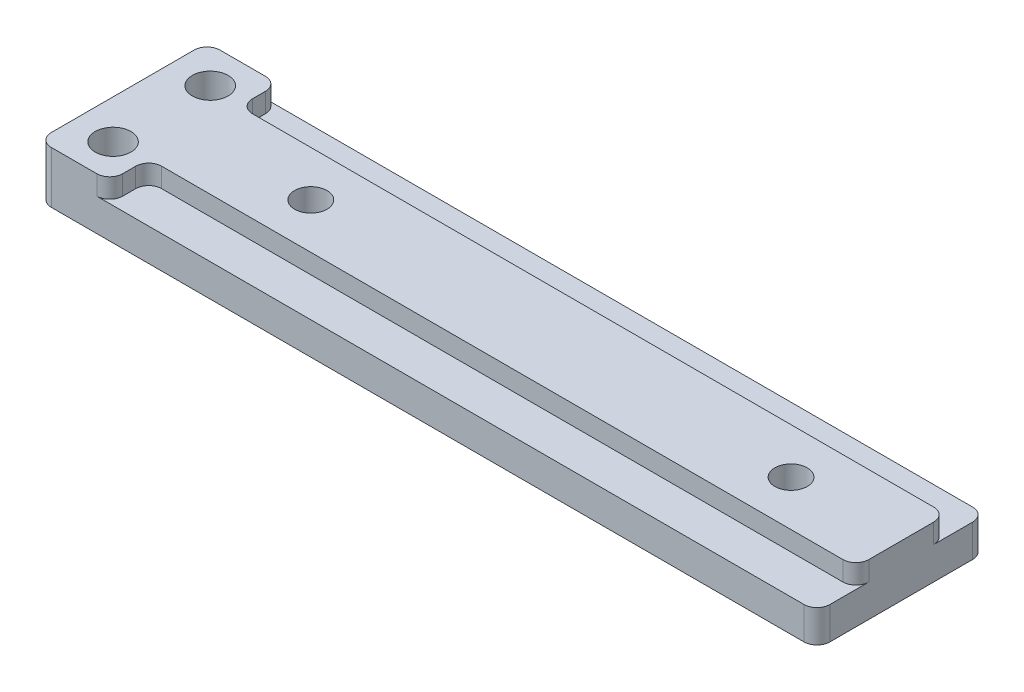
ISO-10303-21;
HEADER;
FILE_DESCRIPTION(('STEP AP214'),'2;1');
FILE_NAME('part.step','',(''),(''),'','','');
FILE_SCHEMA(('AUTOMOTIVE_DESIGN { 1 0 10303 214 1 1 1 1 }'));
ENDSEC;
DATA;
#1=APPLICATION_CONTEXT('core data for automotive mechanical design processes');
#2=APPLICATION_PROTOCOL_DEFINITION('international standard','automotive_design',2000,#1);
#3=PRODUCT_CONTEXT('',#1,'mechanical');
#4=PRODUCT('Part','Part','',(#3));
#5=PRODUCT_RELATED_PRODUCT_CATEGORY('part','',(#4));
#6=PRODUCT_DEFINITION_FORMATION('','',#4);
#7=PRODUCT_DEFINITION_CONTEXT('part definition',#1,'design');
#8=PRODUCT_DEFINITION('design','',#6,#7);
#9=PRODUCT_DEFINITION_SHAPE('','',#8);
#10=(LENGTH_UNIT() NAMED_UNIT(*) SI_UNIT(.MILLI.,.METRE.));
#11=(NAMED_UNIT(*) PLANE_ANGLE_UNIT() SI_UNIT($,.RADIAN.));
#12=(NAMED_UNIT(*) SI_UNIT($,.STERADIAN.) SOLID_ANGLE_UNIT());
#13=UNCERTAINTY_MEASURE_WITH_UNIT(LENGTH_MEASURE(1.E-05),#10,'distance_accuracy_value','');
#14=(GEOMETRIC_REPRESENTATION_CONTEXT(3) GLOBAL_UNCERTAINTY_ASSIGNED_CONTEXT((#13)) GLOBAL_UNIT_ASSIGNED_CONTEXT((#10,
#11,#12)) REPRESENTATION_CONTEXT('',''));
#15=CARTESIAN_POINT('',(0.,0.,0.));
#16=DIRECTION('',(0.,0.,1.));
#17=DIRECTION('',(1.,0.,0.));
#18=AXIS2_PLACEMENT_3D('',#15,#16,#17);
#19=CARTESIAN_POINT('',(0.,10.16,0.));
#20=DIRECTION('',(0.,-1.,0.));
#21=DIRECTION('',(0.,0.,-1.));
#22=AXIS2_PLACEMENT_3D('',#19,#20,#21);
#23=PLANE('',#22);
#24=DIRECTION('',(0.,0.,-1.));
#25=VECTOR('',#24,1.);
#26=CARTESIAN_POINT('',(152.4,10.16,-33.02));
#27=LINE('',#26,#25);
#28=CARTESIAN_POINT('',(152.4,10.16,-10.16));
#29=VERTEX_POINT('',#28);
#30=CARTESIAN_POINT('',(152.4,10.16,-22.86));
#31=VERTEX_POINT('',#30);
#32=EDGE_CURVE('E344',#29,#31,#27,.T.);
#33=ORIENTED_EDGE('',*,*,#32,.T.);
#34=CARTESIAN_POINT('',(149.86,10.16,-22.86));
#35=DIRECTION('',(0.,-1.,0.));
#36=DIRECTION('',(0.,0.,-1.));
#37=AXIS2_PLACEMENT_3D('',#34,#35,#36);
#38=CIRCLE('',#37,2.54);
#39=CARTESIAN_POINT('',(149.86,10.16,-25.4));
#40=VERTEX_POINT('',#39);
#41=EDGE_CURVE('E243',#31,#40,#38,.F.);
#42=ORIENTED_EDGE('',*,*,#41,.T.);
#43=DIRECTION('',(1.,0.,0.));
#44=VECTOR('',#43,1.);
#45=CARTESIAN_POINT('',(13.97,10.16,-25.3999999999999));
#46=LINE('',#45,#44);
#47=CARTESIAN_POINT('',(16.51,10.16,-25.3999999999999));
#48=VERTEX_POINT('',#47);
#49=EDGE_CURVE('E291',#48,#40,#46,.T.);
#50=ORIENTED_EDGE('',*,*,#49,.F.);
#51=CARTESIAN_POINT('',(16.51,10.16,-27.9399999999999));
#52=DIRECTION('',(0.,-1.,0.));
#53=DIRECTION('',(0.,0.,-1.));
#54=AXIS2_PLACEMENT_3D('',#51,#52,#53);
#55=CIRCLE('',#54,2.54);
#56=CARTESIAN_POINT('',(13.97,10.16,-27.9399999999999));
#57=VERTEX_POINT('',#56);
#58=EDGE_CURVE('E47',#48,#57,#55,.T.);
#59=ORIENTED_EDGE('',*,*,#58,.T.);
#60=DIRECTION('',(0.,0.,1.));
#61=VECTOR('',#60,1.);
#62=CARTESIAN_POINT('',(13.97,10.16,-33.0199999999999));
#63=LINE('',#62,#61);
#64=CARTESIAN_POINT('',(13.97,10.16,-30.48));
#65=VERTEX_POINT('',#64);
#66=EDGE_CURVE('E289',#65,#57,#63,.T.);
#67=ORIENTED_EDGE('',*,*,#66,.F.);
#68=CARTESIAN_POINT('',(11.43,10.16,-30.48));
#69=DIRECTION('',(0.,-1.,0.));
#70=DIRECTION('',(0.,0.,-1.));
#71=AXIS2_PLACEMENT_3D('',#68,#69,#70);
#72=CIRCLE('',#71,2.54);
#73=CARTESIAN_POINT('',(11.43,10.16,-33.02));
#74=VERTEX_POINT('',#73);
#75=EDGE_CURVE('E237',#65,#74,#72,.F.);
#76=ORIENTED_EDGE('',*,*,#75,.T.);
#77=DIRECTION('',(-1.,0.,0.));
#78=VECTOR('',#77,1.);
#79=CARTESIAN_POINT('',(0.,10.16,-33.02));
#80=LINE('',#79,#78);
#81=CARTESIAN_POINT('',(2.54,10.16,-33.02));
#82=VERTEX_POINT('',#81);
#83=EDGE_CURVE('E347',#74,#82,#80,.T.);
#84=ORIENTED_EDGE('',*,*,#83,.T.);
#85=CARTESIAN_POINT('',(2.54,10.16,-30.48));
#86=DIRECTION('',(0.,-1.,0.));
#87=DIRECTION('',(0.,0.,-1.));
#88=AXIS2_PLACEMENT_3D('',#85,#86,#87);
#89=CIRCLE('',#88,2.54);
#90=CARTESIAN_POINT('',(0.,10.16,-30.48));
#91=VERTEX_POINT('',#90);
#92=EDGE_CURVE('E235',#82,#91,#89,.F.);
#93=ORIENTED_EDGE('',*,*,#92,.T.);
#94=DIRECTION('',(0.,0.,1.));
#95=VECTOR('',#94,1.);
#96=CARTESIAN_POINT('',(0.,10.16,0.));
#97=LINE('',#96,#95);
#98=CARTESIAN_POINT('',(0.,10.16,-2.54));
#99=VERTEX_POINT('',#98);
#100=EDGE_CURVE('E350',#91,#99,#97,.T.);
#101=ORIENTED_EDGE('',*,*,#100,.T.);
#102=CARTESIAN_POINT('',(2.53999999999999,10.16,-2.54));
#103=DIRECTION('',(0.,-1.,0.));
#104=DIRECTION('',(0.,0.,-1.));
#105=AXIS2_PLACEMENT_3D('',#102,#103,#104);
#106=CIRCLE('',#105,2.54);
#107=CARTESIAN_POINT('',(2.53999999999999,10.16,0.));
#108=VERTEX_POINT('',#107);
#109=EDGE_CURVE('E233',#99,#108,#106,.F.);
#110=ORIENTED_EDGE('',*,*,#109,.T.);
#111=DIRECTION('',(1.,0.,0.));
#112=VECTOR('',#111,1.);
#113=CARTESIAN_POINT('',(152.4,10.16,0.));
#114=LINE('',#113,#112);
#115=CARTESIAN_POINT('',(11.4300000000001,10.16,0.));
#116=VERTEX_POINT('',#115);
#117=EDGE_CURVE('E341',#108,#116,#114,.T.);
#118=ORIENTED_EDGE('',*,*,#117,.T.);
#119=CARTESIAN_POINT('',(11.43,10.16,-2.54));
#120=DIRECTION('',(0.,-1.,0.));
#121=DIRECTION('',(0.,0.,-1.));
#122=AXIS2_PLACEMENT_3D('',#119,#120,#121);
#123=CIRCLE('',#122,2.54);
#124=CARTESIAN_POINT('',(13.97,10.16,-2.54));
#125=VERTEX_POINT('',#124);
#126=EDGE_CURVE('E239',#116,#125,#123,.F.);
#127=ORIENTED_EDGE('',*,*,#126,.T.);
#128=DIRECTION('',(0.,0.,1.));
#129=VECTOR('',#128,1.);
#130=CARTESIAN_POINT('',(13.97,10.16,1.07944055687566E-13));
#131=LINE('',#130,#129);
#132=CARTESIAN_POINT('',(13.97,10.16,-5.07999999999989));
#133=VERTEX_POINT('',#132);
#134=EDGE_CURVE('E390',#133,#125,#131,.T.);
#135=ORIENTED_EDGE('',*,*,#134,.F.);
#136=CARTESIAN_POINT('',(16.51,10.16,-5.07999999999989));
#137=DIRECTION('',(0.,-1.,0.));
#138=DIRECTION('',(0.,0.,-1.));
#139=AXIS2_PLACEMENT_3D('',#136,#137,#138);
#140=CIRCLE('',#139,2.54);
#141=CARTESIAN_POINT('',(16.51,10.16,-7.61999999999989));
#142=VERTEX_POINT('',#141);
#143=EDGE_CURVE('E281',#133,#142,#140,.T.);
#144=ORIENTED_EDGE('',*,*,#143,.T.);
#145=DIRECTION('',(1.,0.,0.));
#146=VECTOR('',#145,1.);
#147=CARTESIAN_POINT('',(13.97,10.16,-7.61999999999989));
#148=LINE('',#147,#146);
#149=CARTESIAN_POINT('',(149.86,10.16,-7.62000000000001));
#150=VERTEX_POINT('',#149);
#151=EDGE_CURVE('E322',#142,#150,#148,.T.);
#152=ORIENTED_EDGE('',*,*,#151,.T.);
#153=CARTESIAN_POINT('',(149.86,10.16,-10.16));
#154=DIRECTION('',(0.,-1.,0.));
#155=DIRECTION('',(0.,0.,-1.));
#156=AXIS2_PLACEMENT_3D('',#153,#154,#155);
#157=CIRCLE('',#156,2.54);
#158=EDGE_CURVE('E241',#150,#29,#157,.F.);
#159=ORIENTED_EDGE('',*,*,#158,.T.);
#160=EDGE_LOOP('',(#33,#42,#50,#59,#67,#76,#84,#93,#101,#110,#118,#127,#135,#144,#152,#159));
#161=FACE_BOUND('',#160,.T.);
#162=CARTESIAN_POINT('',(7.62,10.16,-26.02));
#163=DIRECTION('',(0.,1.,0.));
#164=DIRECTION('',(0.,0.,1.));
#165=AXIS2_PLACEMENT_3D('',#162,#163,#164);
#166=CIRCLE('',#165,3.5);
#167=CARTESIAN_POINT('',(7.62,10.16,-22.52));
#168=VERTEX_POINT('',#167);
#169=EDGE_CURVE('E335',#168,#168,#166,.T.);
#170=ORIENTED_EDGE('',*,*,#169,.F.);
#171=EDGE_LOOP('',(#170));
#172=FACE_BOUND('',#171,.T.);
#173=CARTESIAN_POINT('',(7.61999999999999,10.16,-7.));
#174=DIRECTION('',(0.,1.,0.));
#175=DIRECTION('',(0.,0.,-1.));
#176=AXIS2_PLACEMENT_3D('',#173,#174,#175);
#177=CIRCLE('',#176,3.5);
#178=CARTESIAN_POINT('',(7.61999999999999,10.16,-10.5));
#179=VERTEX_POINT('',#178);
#180=EDGE_CURVE('E329',#179,#179,#177,.T.);
#181=ORIENTED_EDGE('',*,*,#180,.F.);
#182=EDGE_LOOP('',(#181));
#183=FACE_BOUND('',#182,.T.);
#184=CARTESIAN_POINT('',(130.8199949,10.16,-16.51));
#185=DIRECTION('',(0.,1.,0.));
#186=DIRECTION('',(0.,0.,1.));
#187=AXIS2_PLACEMENT_3D('',#184,#185,#186);
#188=CIRCLE('',#187,3.175);
#189=CARTESIAN_POINT('',(130.8199949,10.16,-13.335));
#190=VERTEX_POINT('',#189);
#191=EDGE_CURVE('E323',#190,#190,#188,.T.);
#192=ORIENTED_EDGE('',*,*,#191,.F.);
#193=EDGE_LOOP('',(#192));
#194=FACE_BOUND('',#193,.T.);
#195=CARTESIAN_POINT('',(36.8200051,10.16,-16.51));
#196=DIRECTION('',(0.,1.,0.));
#197=DIRECTION('',(0.,0.,1.));
#198=AXIS2_PLACEMENT_3D('',#195,#196,#197);
#199=CIRCLE('',#198,3.175);
#200=CARTESIAN_POINT('',(36.8200051,10.16,-13.335));
#201=VERTEX_POINT('',#200);
#202=EDGE_CURVE('E315',#201,#201,#199,.T.);
#203=ORIENTED_EDGE('',*,*,#202,.F.);
#204=EDGE_LOOP('',(#203));
#205=FACE_BOUND('',#204,.T.);
#206=ADVANCED_FACE('F39',(#161,#172,#183,#194,#205),#23,.F.);
#207=CARTESIAN_POINT('',(0.,0.,0.));
#208=DIRECTION('',(0.,-1.,0.));
#209=DIRECTION('',(0.,0.,-1.));
#210=AXIS2_PLACEMENT_3D('',#207,#208,#209);
#211=PLANE('',#210);
#212=CARTESIAN_POINT('',(130.8199949,0.,-16.51));
#213=DIRECTION('',(0.,1.,0.));
#214=DIRECTION('',(0.,0.,1.));
#215=AXIS2_PLACEMENT_3D('',#212,#213,#214);
#216=CIRCLE('',#215,3.175);
#217=CARTESIAN_POINT('',(130.8199949,0.,-13.335));
#218=VERTEX_POINT('',#217);
#219=EDGE_CURVE('E318',#218,#218,#216,.T.);
#220=ORIENTED_EDGE('',*,*,#219,.T.);
#221=EDGE_LOOP('',(#220));
#222=FACE_BOUND('',#221,.T.);
#223=CARTESIAN_POINT('',(7.62,0.,-26.02));
#224=DIRECTION('',(0.,1.,0.));
#225=DIRECTION('',(0.,0.,1.));
#226=AXIS2_PLACEMENT_3D('',#223,#224,#225);
#227=CIRCLE('',#226,3.5);
#228=CARTESIAN_POINT('',(7.62,0.,-22.52));
#229=VERTEX_POINT('',#228);
#230=EDGE_CURVE('E332',#229,#229,#227,.T.);
#231=ORIENTED_EDGE('',*,*,#230,.T.);
#232=EDGE_LOOP('',(#231));
#233=FACE_BOUND('',#232,.T.);
#234=DIRECTION('',(-1.,0.,0.));
#235=VECTOR('',#234,1.);
#236=CARTESIAN_POINT('',(0.,0.,-33.02));
#237=LINE('',#236,#235);
#238=CARTESIAN_POINT('',(149.86,0.,-33.02));
#239=VERTEX_POINT('',#238);
#240=CARTESIAN_POINT('',(2.54,0.,-33.02));
#241=VERTEX_POINT('',#240);
#242=EDGE_CURVE('E358',#239,#241,#237,.T.);
#243=ORIENTED_EDGE('',*,*,#242,.F.);
#244=CARTESIAN_POINT('',(149.86,0.,-30.48));
#245=DIRECTION('',(0.,-1.,0.));
#246=DIRECTION('',(0.,0.,-1.));
#247=AXIS2_PLACEMENT_3D('',#244,#245,#246);
#248=CIRCLE('',#247,2.54);
#249=CARTESIAN_POINT('',(152.4,0.,-30.48));
#250=VERTEX_POINT('',#249);
#251=EDGE_CURVE('E205',#239,#250,#248,.T.);
#252=ORIENTED_EDGE('',*,*,#251,.T.);
#253=DIRECTION('',(0.,0.,-1.));
#254=VECTOR('',#253,1.);
#255=CARTESIAN_POINT('',(152.4,0.,-33.02));
#256=LINE('',#255,#254);
#257=CARTESIAN_POINT('',(152.4,0.,-2.54000000000001));
#258=VERTEX_POINT('',#257);
#259=EDGE_CURVE('E355',#258,#250,#256,.T.);
#260=ORIENTED_EDGE('',*,*,#259,.F.);
#261=CARTESIAN_POINT('',(149.86,0.,-2.54000000000001));
#262=DIRECTION('',(0.,-1.,0.));
#263=DIRECTION('',(0.,0.,-1.));
#264=AXIS2_PLACEMENT_3D('',#261,#262,#263);
#265=CIRCLE('',#264,2.54);
#266=CARTESIAN_POINT('',(149.86,0.,0.));
#267=VERTEX_POINT('',#266);
#268=EDGE_CURVE('E215',#258,#267,#265,.T.);
#269=ORIENTED_EDGE('',*,*,#268,.T.);
#270=DIRECTION('',(1.,0.,0.));
#271=VECTOR('',#270,1.);
#272=CARTESIAN_POINT('',(152.4,0.,0.));
#273=LINE('',#272,#271);
#274=CARTESIAN_POINT('',(2.53999999999999,0.,0.));
#275=VERTEX_POINT('',#274);
#276=EDGE_CURVE('E338',#275,#267,#273,.T.);
#277=ORIENTED_EDGE('',*,*,#276,.F.);
#278=CARTESIAN_POINT('',(2.53999999999999,0.,-2.54));
#279=DIRECTION('',(0.,-1.,0.));
#280=DIRECTION('',(0.,0.,-1.));
#281=AXIS2_PLACEMENT_3D('',#278,#279,#280);
#282=CIRCLE('',#281,2.54);
#283=CARTESIAN_POINT('',(0.,0.,-2.54));
#284=VERTEX_POINT('',#283);
#285=EDGE_CURVE('E206',#275,#284,#282,.T.);
#286=ORIENTED_EDGE('',*,*,#285,.T.);
#287=DIRECTION('',(0.,0.,1.));
#288=VECTOR('',#287,1.);
#289=CARTESIAN_POINT('',(0.,0.,0.));
#290=LINE('',#289,#288);
#291=CARTESIAN_POINT('',(0.,0.,-30.48));
#292=VERTEX_POINT('',#291);
#293=EDGE_CURVE('E345',#292,#284,#290,.T.);
#294=ORIENTED_EDGE('',*,*,#293,.F.);
#295=CARTESIAN_POINT('',(2.54,0.,-30.48));
#296=DIRECTION('',(0.,-1.,0.));
#297=DIRECTION('',(0.,0.,-1.));
#298=AXIS2_PLACEMENT_3D('',#295,#296,#297);
#299=CIRCLE('',#298,2.54);
#300=EDGE_CURVE('E208',#292,#241,#299,.T.);
#301=ORIENTED_EDGE('',*,*,#300,.T.);
#302=EDGE_LOOP('',(#243,#252,#260,#269,#277,#286,#294,#301));
#303=FACE_BOUND('',#302,.T.);
#304=CARTESIAN_POINT('',(7.61999999999999,0.,-7.));
#305=DIRECTION('',(0.,1.,0.));
#306=DIRECTION('',(0.,0.,-1.));
#307=AXIS2_PLACEMENT_3D('',#304,#305,#306);
#308=CIRCLE('',#307,3.5);
#309=CARTESIAN_POINT('',(7.61999999999999,0.,-10.5));
#310=VERTEX_POINT('',#309);
#311=EDGE_CURVE('E326',#310,#310,#308,.T.);
#312=ORIENTED_EDGE('',*,*,#311,.T.);
#313=EDGE_LOOP('',(#312));
#314=FACE_BOUND('',#313,.T.);
#315=CARTESIAN_POINT('',(36.8200051,0.,-16.51));
#316=DIRECTION('',(0.,1.,0.));
#317=DIRECTION('',(0.,0.,1.));
#318=AXIS2_PLACEMENT_3D('',#315,#316,#317);
#319=CIRCLE('',#318,3.175);
#320=CARTESIAN_POINT('',(36.8200051,0.,-13.335));
#321=VERTEX_POINT('',#320);
#322=EDGE_CURVE('E319',#321,#321,#319,.T.);
#323=ORIENTED_EDGE('',*,*,#322,.T.);
#324=EDGE_LOOP('',(#323));
#325=FACE_BOUND('',#324,.T.);
#326=ADVANCED_FACE('F372',(#222,#233,#303,#314,#325),#211,.T.);
#327=CARTESIAN_POINT('',(152.4,10.16,0.));
#328=DIRECTION('',(0.,0.,-1.));
#329=DIRECTION('',(-1.,0.,0.));
#330=AXIS2_PLACEMENT_3D('',#327,#328,#329);
#331=PLANE('',#330);
#332=ORIENTED_EDGE('',*,*,#276,.T.);
#333=DIRECTION('',(0.,-1.,0.));
#334=VECTOR('',#333,1.);
#335=CARTESIAN_POINT('',(149.86,10.16,0.));
#336=LINE('',#335,#334);
#337=CARTESIAN_POINT('',(149.86,6.35,0.));
#338=VERTEX_POINT('',#337);
#339=EDGE_CURVE('E250',#267,#338,#336,.F.);
#340=ORIENTED_EDGE('',*,*,#339,.T.);
#341=DIRECTION('',(1.,0.,0.));
#342=VECTOR('',#341,1.);
#343=CARTESIAN_POINT('',(13.97,6.35,1.07944055687566E-13));
#344=LINE('',#343,#342);
#345=CARTESIAN_POINT('',(11.43,6.35,0.));
#346=VERTEX_POINT('',#345);
#347=EDGE_CURVE('E394',#346,#338,#344,.T.);
#348=ORIENTED_EDGE('',*,*,#347,.F.);
#349=DIRECTION('',(0.,-1.,0.));
#350=VECTOR('',#349,1.);
#351=CARTESIAN_POINT('',(11.4300000000001,10.16,0.));
#352=LINE('',#351,#350);
#353=EDGE_CURVE('E248',#346,#116,#352,.F.);
#354=ORIENTED_EDGE('',*,*,#353,.T.);
#355=ORIENTED_EDGE('',*,*,#117,.F.);
#356=DIRECTION('',(0.,-1.,0.));
#357=VECTOR('',#356,1.);
#358=CARTESIAN_POINT('',(2.53999999999999,10.16,0.));
#359=LINE('',#358,#357);
#360=EDGE_CURVE('E245',#108,#275,#359,.T.);
#361=ORIENTED_EDGE('',*,*,#360,.T.);
#362=EDGE_LOOP('',(#332,#340,#348,#354,#355,#361));
#363=FACE_BOUND('',#362,.T.);
#364=ADVANCED_FACE('F380',(#363),#331,.F.);
#365=CARTESIAN_POINT('',(152.4,10.16,-33.02));
#366=DIRECTION('',(-1.,0.,0.));
#367=DIRECTION('',(0.,0.,1.));
#368=AXIS2_PLACEMENT_3D('',#365,#366,#367);
#369=PLANE('',#368);
#370=ORIENTED_EDGE('',*,*,#259,.T.);
#371=DIRECTION('',(0.,-1.,0.));
#372=VECTOR('',#371,1.);
#373=CARTESIAN_POINT('',(152.4,10.16,-30.48));
#374=LINE('',#373,#372);
#375=CARTESIAN_POINT('',(152.4,6.35000000000001,-30.48));
#376=VERTEX_POINT('',#375);
#377=EDGE_CURVE('E226',#250,#376,#374,.F.);
#378=ORIENTED_EDGE('',*,*,#377,.T.);
#379=DIRECTION('',(0.,0.,-1.));
#380=VECTOR('',#379,1.);
#381=CARTESIAN_POINT('',(152.4,6.35,-25.4));
#382=LINE('',#381,#380);
#383=CARTESIAN_POINT('',(152.4,6.35,-22.86));
#384=VERTEX_POINT('',#383);
#385=EDGE_CURVE('E185',#384,#376,#382,.T.);
#386=ORIENTED_EDGE('',*,*,#385,.F.);
#387=DIRECTION('',(0.,-1.,0.));
#388=VECTOR('',#387,1.);
#389=CARTESIAN_POINT('',(152.4,10.16,-22.86));
#390=LINE('',#389,#388);
#391=EDGE_CURVE('E224',#384,#31,#390,.F.);
#392=ORIENTED_EDGE('',*,*,#391,.T.);
#393=ORIENTED_EDGE('',*,*,#32,.F.);
#394=DIRECTION('',(0.,1.,0.));
#395=VECTOR('',#394,1.);
#396=CARTESIAN_POINT('',(152.4,10.16,-10.16));
#397=LINE('',#396,#395);
#398=CARTESIAN_POINT('',(152.4,6.35,-10.16));
#399=VERTEX_POINT('',#398);
#400=EDGE_CURVE('E218',#29,#399,#397,.F.);
#401=ORIENTED_EDGE('',*,*,#400,.T.);
#402=DIRECTION('',(0.,0.,-1.));
#403=VECTOR('',#402,1.);
#404=CARTESIAN_POINT('',(152.4,6.35,-7.62000000000001));
#405=LINE('',#404,#403);
#406=CARTESIAN_POINT('',(152.4,6.35,-2.54000000000001));
#407=VERTEX_POINT('',#406);
#408=EDGE_CURVE('E313',#407,#399,#405,.T.);
#409=ORIENTED_EDGE('',*,*,#408,.F.);
#410=DIRECTION('',(0.,-1.,0.));
#411=VECTOR('',#410,1.);
#412=CARTESIAN_POINT('',(152.4,10.16,-2.54000000000001));
#413=LINE('',#412,#411);
#414=EDGE_CURVE('E221',#407,#258,#413,.T.);
#415=ORIENTED_EDGE('',*,*,#414,.T.);
#416=EDGE_LOOP('',(#370,#378,#386,#392,#393,#401,#409,#415));
#417=FACE_BOUND('',#416,.T.);
#418=ADVANCED_FACE('F409',(#417),#369,.F.);
#419=CARTESIAN_POINT('',(0.,10.16,-33.02));
#420=DIRECTION('',(0.,0.,1.));
#421=DIRECTION('',(1.,0.,0.));
#422=AXIS2_PLACEMENT_3D('',#419,#420,#421);
#423=PLANE('',#422);
#424=DIRECTION('',(1.,0.,0.));
#425=VECTOR('',#424,1.);
#426=CARTESIAN_POINT('',(13.97,6.35000000000001,-33.0199999999999));
#427=LINE('',#426,#425);
#428=CARTESIAN_POINT('',(11.43,6.35000000000001,-33.0199999999999));
#429=VERTEX_POINT('',#428);
#430=CARTESIAN_POINT('',(149.86,6.35000000000001,-33.02));
#431=VERTEX_POINT('',#430);
#432=EDGE_CURVE('E182',#429,#431,#427,.T.);
#433=ORIENTED_EDGE('',*,*,#432,.T.);
#434=DIRECTION('',(0.,-1.,0.));
#435=VECTOR('',#434,1.);
#436=CARTESIAN_POINT('',(149.86,10.16,-33.02));
#437=LINE('',#436,#435);
#438=EDGE_CURVE('E196',#431,#239,#437,.T.);
#439=ORIENTED_EDGE('',*,*,#438,.T.);
#440=ORIENTED_EDGE('',*,*,#242,.T.);
#441=DIRECTION('',(0.,-1.,0.));
#442=VECTOR('',#441,1.);
#443=CARTESIAN_POINT('',(2.54,10.16,-33.02));
#444=LINE('',#443,#442);
#445=EDGE_CURVE('E210',#241,#82,#444,.F.);
#446=ORIENTED_EDGE('',*,*,#445,.T.);
#447=ORIENTED_EDGE('',*,*,#83,.F.);
#448=DIRECTION('',(0.,1.,0.));
#449=VECTOR('',#448,1.);
#450=CARTESIAN_POINT('',(11.43,6.35,-33.02));
#451=LINE('',#450,#449);
#452=EDGE_CURVE('E200',#74,#429,#451,.F.);
#453=ORIENTED_EDGE('',*,*,#452,.T.);
#454=EDGE_LOOP('',(#433,#439,#440,#446,#447,#453));
#455=FACE_BOUND('',#454,.T.);
#456=ADVANCED_FACE('F194',(#455),#423,.F.);
#457=CARTESIAN_POINT('',(0.,10.16,0.));
#458=DIRECTION('',(1.,0.,0.));
#459=DIRECTION('',(0.,0.,-1.));
#460=AXIS2_PLACEMENT_3D('',#457,#458,#459);
#461=PLANE('',#460);
#462=ORIENTED_EDGE('',*,*,#100,.F.);
#463=DIRECTION('',(0.,-1.,0.));
#464=VECTOR('',#463,1.);
#465=CARTESIAN_POINT('',(0.,10.16,-30.48));
#466=LINE('',#465,#464);
#467=EDGE_CURVE('E273',#91,#292,#466,.T.);
#468=ORIENTED_EDGE('',*,*,#467,.T.);
#469=ORIENTED_EDGE('',*,*,#293,.T.);
#470=DIRECTION('',(0.,-1.,0.));
#471=VECTOR('',#470,1.);
#472=CARTESIAN_POINT('',(0.,10.16,-2.54));
#473=LINE('',#472,#471);
#474=EDGE_CURVE('E271',#284,#99,#473,.F.);
#475=ORIENTED_EDGE('',*,*,#474,.T.);
#476=EDGE_LOOP('',(#462,#468,#469,#475));
#477=FACE_BOUND('',#476,.T.);
#478=ADVANCED_FACE('F369',(#477),#461,.F.);
#479=CARTESIAN_POINT('',(7.62,10.16,-26.02));
#480=DIRECTION('',(0.,-1.,0.));
#481=DIRECTION('',(0.,0.,-1.));
#482=AXIS2_PLACEMENT_3D('',#479,#480,#481);
#483=CYLINDRICAL_SURFACE('',#482,3.5);
#484=ORIENTED_EDGE('',*,*,#169,.T.);
#485=EDGE_LOOP('',(#484));
#486=FACE_BOUND('',#485,.T.);
#487=ORIENTED_EDGE('',*,*,#230,.F.);
#488=EDGE_LOOP('',(#487));
#489=FACE_BOUND('',#488,.T.);
#490=ADVANCED_FACE('F441',(#486,#489),#483,.F.);
#491=CARTESIAN_POINT('',(7.61999999999999,10.16,-7.));
#492=DIRECTION('',(0.,-1.,0.));
#493=DIRECTION('',(0.,0.,-1.));
#494=AXIS2_PLACEMENT_3D('',#491,#492,#493);
#495=CYLINDRICAL_SURFACE('',#494,3.5);
#496=ORIENTED_EDGE('',*,*,#180,.T.);
#497=EDGE_LOOP('',(#496));
#498=FACE_BOUND('',#497,.T.);
#499=ORIENTED_EDGE('',*,*,#311,.F.);
#500=EDGE_LOOP('',(#499));
#501=FACE_BOUND('',#500,.T.);
#502=ADVANCED_FACE('F610',(#498,#501),#495,.F.);
#503=CARTESIAN_POINT('',(130.8199949,10.16,-16.51));
#504=DIRECTION('',(0.,-1.,0.));
#505=DIRECTION('',(0.,0.,-1.));
#506=AXIS2_PLACEMENT_3D('',#503,#504,#505);
#507=CYLINDRICAL_SURFACE('',#506,3.175);
#508=ORIENTED_EDGE('',*,*,#191,.T.);
#509=EDGE_LOOP('',(#508));
#510=FACE_BOUND('',#509,.T.);
#511=ORIENTED_EDGE('',*,*,#219,.F.);
#512=EDGE_LOOP('',(#511));
#513=FACE_BOUND('',#512,.T.);
#514=ADVANCED_FACE('F601',(#510,#513),#507,.F.);
#515=CARTESIAN_POINT('',(36.8200051,10.16,-16.51));
#516=DIRECTION('',(0.,-1.,0.));
#517=DIRECTION('',(0.,0.,-1.));
#518=AXIS2_PLACEMENT_3D('',#515,#516,#517);
#519=CYLINDRICAL_SURFACE('',#518,3.175);
#520=ORIENTED_EDGE('',*,*,#202,.T.);
#521=EDGE_LOOP('',(#520));
#522=FACE_BOUND('',#521,.T.);
#523=ORIENTED_EDGE('',*,*,#322,.F.);
#524=EDGE_LOOP('',(#523));
#525=FACE_BOUND('',#524,.T.);
#526=ADVANCED_FACE('F478',(#522,#525),#519,.F.);
#527=CARTESIAN_POINT('',(13.97,6.35,-25.3999999999999));
#528=DIRECTION('',(0.,-1.,0.));
#529=DIRECTION('',(0.,0.,-1.));
#530=AXIS2_PLACEMENT_3D('',#527,#528,#529);
#531=PLANE('',#530);
#532=ORIENTED_EDGE('',*,*,#385,.T.);
#533=CARTESIAN_POINT('',(149.86,6.35,-30.48));
#534=DIRECTION('',(0.,-1.,0.));
#535=DIRECTION('',(0.,0.,-1.));
#536=AXIS2_PLACEMENT_3D('',#533,#534,#535);
#537=CIRCLE('',#536,2.54);
#538=EDGE_CURVE('E179',#376,#431,#537,.F.);
#539=ORIENTED_EDGE('',*,*,#538,.T.);
#540=ORIENTED_EDGE('',*,*,#432,.F.);
#541=CARTESIAN_POINT('',(11.43,6.35000000000001,-30.48));
#542=DIRECTION('',(0.,-1.,0.));
#543=DIRECTION('',(0.,0.,-1.));
#544=AXIS2_PLACEMENT_3D('',#541,#542,#543);
#545=CIRCLE('',#544,2.54);
#546=CARTESIAN_POINT('',(13.97,6.35000000000001,-30.48));
#547=VERTEX_POINT('',#546);
#548=EDGE_CURVE('E11',#429,#547,#545,.T.);
#549=ORIENTED_EDGE('',*,*,#548,.T.);
#550=DIRECTION('',(0.,0.,-1.));
#551=VECTOR('',#550,1.);
#552=CARTESIAN_POINT('',(13.97,6.35,-25.3999999999999));
#553=LINE('',#552,#551);
#554=CARTESIAN_POINT('',(13.97,6.35,-27.9399999999999));
#555=VERTEX_POINT('',#554);
#556=EDGE_CURVE('E300',#555,#547,#553,.T.);
#557=ORIENTED_EDGE('',*,*,#556,.F.);
#558=CARTESIAN_POINT('',(16.51,6.35,-27.9399999999999));
#559=DIRECTION('',(0.,-1.,0.));
#560=DIRECTION('',(0.,0.,-1.));
#561=AXIS2_PLACEMENT_3D('',#558,#559,#560);
#562=CIRCLE('',#561,2.54);
#563=CARTESIAN_POINT('',(16.51,6.35,-25.3999999999999));
#564=VERTEX_POINT('',#563);
#565=EDGE_CURVE('E190',#555,#564,#562,.F.);
#566=ORIENTED_EDGE('',*,*,#565,.T.);
#567=DIRECTION('',(1.,0.,0.));
#568=VECTOR('',#567,1.);
#569=CARTESIAN_POINT('',(13.97,6.35,-25.3999999999999));
#570=LINE('',#569,#568);
#571=CARTESIAN_POINT('',(149.86,6.35,-25.4));
#572=VERTEX_POINT('',#571);
#573=EDGE_CURVE('E202',#564,#572,#570,.T.);
#574=ORIENTED_EDGE('',*,*,#573,.T.);
#575=CARTESIAN_POINT('',(149.86,6.35,-22.86));
#576=DIRECTION('',(0.,-1.,0.));
#577=DIRECTION('',(0.,0.,-1.));
#578=AXIS2_PLACEMENT_3D('',#575,#576,#577);
#579=CIRCLE('',#578,2.54);
#580=EDGE_CURVE('E276',#572,#384,#579,.T.);
#581=ORIENTED_EDGE('',*,*,#580,.T.);
#582=EDGE_LOOP('',(#532,#539,#540,#549,#557,#566,#574,#581));
#583=FACE_BOUND('',#582,.T.);
#584=ADVANCED_FACE('F181',(#583),#531,.F.);
#585=CARTESIAN_POINT('',(13.97,10.16,-25.3999999999999));
#586=DIRECTION('',(0.,0.,1.));
#587=DIRECTION('',(1.,0.,0.));
#588=AXIS2_PLACEMENT_3D('',#585,#586,#587);
#589=PLANE('',#588);
#590=ORIENTED_EDGE('',*,*,#49,.T.);
#591=DIRECTION('',(0.,-1.,0.));
#592=VECTOR('',#591,1.);
#593=CARTESIAN_POINT('',(149.86,10.16,-25.4));
#594=LINE('',#593,#592);
#595=EDGE_CURVE('E230',#40,#572,#594,.T.);
#596=ORIENTED_EDGE('',*,*,#595,.T.);
#597=ORIENTED_EDGE('',*,*,#573,.F.);
#598=DIRECTION('',(0.,-1.,0.));
#599=VECTOR('',#598,1.);
#600=CARTESIAN_POINT('',(16.51,10.16,-25.3999999999999));
#601=LINE('',#600,#599);
#602=EDGE_CURVE('E189',#564,#48,#601,.F.);
#603=ORIENTED_EDGE('',*,*,#602,.T.);
#604=EDGE_LOOP('',(#590,#596,#597,#603));
#605=FACE_BOUND('',#604,.T.);
#606=ADVANCED_FACE('F306',(#605),#589,.F.);
#607=CARTESIAN_POINT('',(13.97,0.,1.16359913157829E-13));
#608=DIRECTION('',(1.,0.,0.));
#609=DIRECTION('',(0.,0.,-1.));
#610=AXIS2_PLACEMENT_3D('',#607,#608,#609);
#611=PLANE('',#610);
#612=ORIENTED_EDGE('',*,*,#66,.T.);
#613=DIRECTION('',(0.,-1.,0.));
#614=VECTOR('',#613,1.);
#615=CARTESIAN_POINT('',(13.97,0.,-27.9399999999999));
#616=LINE('',#615,#614);
#617=EDGE_CURVE('E268',#57,#555,#616,.T.);
#618=ORIENTED_EDGE('',*,*,#617,.T.);
#619=ORIENTED_EDGE('',*,*,#556,.T.);
#620=DIRECTION('',(0.,1.,0.));
#621=VECTOR('',#620,1.);
#622=CARTESIAN_POINT('',(13.97,10.16,-30.48));
#623=LINE('',#622,#621);
#624=EDGE_CURVE('E265',#547,#65,#623,.T.);
#625=ORIENTED_EDGE('',*,*,#624,.T.);
#626=EDGE_LOOP('',(#612,#618,#619,#625));
#627=FACE_BOUND('',#626,.T.);
#628=ADVANCED_FACE('F296',(#627),#611,.T.);
#629=CARTESIAN_POINT('',(13.97,10.16,-7.61999999999989));
#630=DIRECTION('',(0.,0.,-1.));
#631=DIRECTION('',(-1.,0.,0.));
#632=AXIS2_PLACEMENT_3D('',#629,#630,#631);
#633=PLANE('',#632);
#634=DIRECTION('',(1.,0.,0.));
#635=VECTOR('',#634,1.);
#636=CARTESIAN_POINT('',(13.97,6.35,-7.61999999999989));
#637=LINE('',#636,#635);
#638=CARTESIAN_POINT('',(16.51,6.35,-7.61999999999989));
#639=VERTEX_POINT('',#638);
#640=CARTESIAN_POINT('',(149.86,6.35,-7.62000000000001));
#641=VERTEX_POINT('',#640);
#642=EDGE_CURVE('E400',#639,#641,#637,.T.);
#643=ORIENTED_EDGE('',*,*,#642,.T.);
#644=DIRECTION('',(0.,1.,0.));
#645=VECTOR('',#644,1.);
#646=CARTESIAN_POINT('',(149.86,10.16,-7.62000000000001));
#647=LINE('',#646,#645);
#648=EDGE_CURVE('E257',#641,#150,#647,.T.);
#649=ORIENTED_EDGE('',*,*,#648,.T.);
#650=ORIENTED_EDGE('',*,*,#151,.F.);
#651=DIRECTION('',(0.,1.,0.));
#652=VECTOR('',#651,1.);
#653=CARTESIAN_POINT('',(16.51,6.35,-7.61999999999989));
#654=LINE('',#653,#652);
#655=EDGE_CURVE('E255',#142,#639,#654,.F.);
#656=ORIENTED_EDGE('',*,*,#655,.T.);
#657=EDGE_LOOP('',(#643,#649,#650,#656));
#658=FACE_BOUND('',#657,.T.);
#659=ADVANCED_FACE('F416',(#658),#633,.F.);
#660=CARTESIAN_POINT('',(13.97,6.35,-7.61999999999989));
#661=DIRECTION('',(0.,-1.,0.));
#662=DIRECTION('',(0.,0.,-1.));
#663=AXIS2_PLACEMENT_3D('',#660,#661,#662);
#664=PLANE('',#663);
#665=ORIENTED_EDGE('',*,*,#347,.T.);
#666=CARTESIAN_POINT('',(149.86,6.35,-2.54000000000001));
#667=DIRECTION('',(0.,-1.,0.));
#668=DIRECTION('',(0.,0.,-1.));
#669=AXIS2_PLACEMENT_3D('',#666,#667,#668);
#670=CIRCLE('',#669,2.54);
#671=EDGE_CURVE('E253',#338,#407,#670,.F.);
#672=ORIENTED_EDGE('',*,*,#671,.T.);
#673=ORIENTED_EDGE('',*,*,#408,.T.);
#674=CARTESIAN_POINT('',(149.86,6.35,-10.16));
#675=DIRECTION('',(0.,-1.,0.));
#676=DIRECTION('',(0.,0.,-1.));
#677=AXIS2_PLACEMENT_3D('',#674,#675,#676);
#678=CIRCLE('',#677,2.54);
#679=EDGE_CURVE('E278',#399,#641,#678,.T.);
#680=ORIENTED_EDGE('',*,*,#679,.T.);
#681=ORIENTED_EDGE('',*,*,#642,.F.);
#682=CARTESIAN_POINT('',(16.51,6.35,-5.07999999999989));
#683=DIRECTION('',(0.,-1.,0.));
#684=DIRECTION('',(0.,0.,-1.));
#685=AXIS2_PLACEMENT_3D('',#682,#683,#684);
#686=CIRCLE('',#685,2.54);
#687=CARTESIAN_POINT('',(13.97,6.35,-5.07999999999989));
#688=VERTEX_POINT('',#687);
#689=EDGE_CURVE('E54',#639,#688,#686,.F.);
#690=ORIENTED_EDGE('',*,*,#689,.T.);
#691=DIRECTION('',(0.,0.,-1.));
#692=VECTOR('',#691,1.);
#693=CARTESIAN_POINT('',(13.97,6.35,-7.61999999999989));
#694=LINE('',#693,#692);
#695=CARTESIAN_POINT('',(13.97,6.35,-2.54));
#696=VERTEX_POINT('',#695);
#697=EDGE_CURVE('E388',#696,#688,#694,.T.);
#698=ORIENTED_EDGE('',*,*,#697,.F.);
#699=CARTESIAN_POINT('',(11.43,6.35,-2.54));
#700=DIRECTION('',(0.,-1.,0.));
#701=DIRECTION('',(0.,0.,-1.));
#702=AXIS2_PLACEMENT_3D('',#699,#700,#701);
#703=CIRCLE('',#702,2.54);
#704=EDGE_CURVE('E62',#696,#346,#703,.T.);
#705=ORIENTED_EDGE('',*,*,#704,.T.);
#706=EDGE_LOOP('',(#665,#672,#673,#680,#681,#690,#698,#705));
#707=FACE_BOUND('',#706,.T.);
#708=ADVANCED_FACE('F392',(#707),#664,.F.);
#709=CARTESIAN_POINT('',(13.97,0.,1.16359913157829E-13));
#710=DIRECTION('',(-1.,0.,0.));
#711=DIRECTION('',(0.,0.,1.));
#712=AXIS2_PLACEMENT_3D('',#709,#710,#711);
#713=PLANE('',#712);
#714=ORIENTED_EDGE('',*,*,#134,.T.);
#715=DIRECTION('',(0.,-1.,0.));
#716=VECTOR('',#715,1.);
#717=CARTESIAN_POINT('',(13.97,0.,-2.54));
#718=LINE('',#717,#716);
#719=EDGE_CURVE('E263',#125,#696,#718,.T.);
#720=ORIENTED_EDGE('',*,*,#719,.T.);
#721=ORIENTED_EDGE('',*,*,#697,.T.);
#722=DIRECTION('',(0.,1.,0.));
#723=VECTOR('',#722,1.);
#724=CARTESIAN_POINT('',(13.97,10.16,-5.07999999999989));
#725=LINE('',#724,#723);
#726=EDGE_CURVE('E260',#688,#133,#725,.T.);
#727=ORIENTED_EDGE('',*,*,#726,.T.);
#728=EDGE_LOOP('',(#714,#720,#721,#727));
#729=FACE_BOUND('',#728,.T.);
#730=ADVANCED_FACE('F387',(#729),#713,.F.);
#731=CARTESIAN_POINT('',(149.86,10.16,-30.48));
#732=DIRECTION('',(0.,-1.,0.));
#733=DIRECTION('',(0.,0.,-1.));
#734=AXIS2_PLACEMENT_3D('',#731,#732,#733);
#735=CYLINDRICAL_SURFACE('',#734,2.54);
#736=ORIENTED_EDGE('',*,*,#538,.F.);
#737=ORIENTED_EDGE('',*,*,#377,.F.);
#738=ORIENTED_EDGE('',*,*,#251,.F.);
#739=ORIENTED_EDGE('',*,*,#438,.F.);
#740=EDGE_LOOP('',(#736,#737,#738,#739));
#741=FACE_BOUND('',#740,.T.);
#742=ADVANCED_FACE('F204',(#741),#735,.T.);
#743=CARTESIAN_POINT('',(149.86,10.16,-22.86));
#744=DIRECTION('',(0.,-1.,0.));
#745=DIRECTION('',(0.,0.,-1.));
#746=AXIS2_PLACEMENT_3D('',#743,#744,#745);
#747=CYLINDRICAL_SURFACE('',#746,2.54);
#748=ORIENTED_EDGE('',*,*,#41,.F.);
#749=ORIENTED_EDGE('',*,*,#391,.F.);
#750=ORIENTED_EDGE('',*,*,#580,.F.);
#751=ORIENTED_EDGE('',*,*,#595,.F.);
#752=EDGE_LOOP('',(#748,#749,#750,#751));
#753=FACE_BOUND('',#752,.T.);
#754=ADVANCED_FACE('F423',(#753),#747,.T.);
#755=CARTESIAN_POINT('',(149.86,10.16,-2.54000000000001));
#756=DIRECTION('',(0.,-1.,0.));
#757=DIRECTION('',(0.,0.,-1.));
#758=AXIS2_PLACEMENT_3D('',#755,#756,#757);
#759=CYLINDRICAL_SURFACE('',#758,2.54);
#760=ORIENTED_EDGE('',*,*,#671,.F.);
#761=ORIENTED_EDGE('',*,*,#339,.F.);
#762=ORIENTED_EDGE('',*,*,#268,.F.);
#763=ORIENTED_EDGE('',*,*,#414,.F.);
#764=EDGE_LOOP('',(#760,#761,#762,#763));
#765=FACE_BOUND('',#764,.T.);
#766=ADVANCED_FACE('F406',(#765),#759,.T.);
#767=CARTESIAN_POINT('',(149.86,10.16,-10.16));
#768=DIRECTION('',(0.,1.,0.));
#769=DIRECTION('',(0.,0.,1.));
#770=AXIS2_PLACEMENT_3D('',#767,#768,#769);
#771=CYLINDRICAL_SURFACE('',#770,2.54);
#772=ORIENTED_EDGE('',*,*,#679,.F.);
#773=ORIENTED_EDGE('',*,*,#400,.F.);
#774=ORIENTED_EDGE('',*,*,#158,.F.);
#775=ORIENTED_EDGE('',*,*,#648,.F.);
#776=EDGE_LOOP('',(#772,#773,#774,#775));
#777=FACE_BOUND('',#776,.T.);
#778=ADVANCED_FACE('F419',(#777),#771,.T.);
#779=CARTESIAN_POINT('',(11.43,0.,-2.54));
#780=DIRECTION('',(0.,-1.,0.));
#781=DIRECTION('',(0.,0.,-1.));
#782=AXIS2_PLACEMENT_3D('',#779,#780,#781);
#783=CYLINDRICAL_SURFACE('',#782,2.54);
#784=ORIENTED_EDGE('',*,*,#126,.F.);
#785=ORIENTED_EDGE('',*,*,#353,.F.);
#786=ORIENTED_EDGE('',*,*,#704,.F.);
#787=ORIENTED_EDGE('',*,*,#719,.F.);
#788=EDGE_LOOP('',(#784,#785,#786,#787));
#789=FACE_BOUND('',#788,.T.);
#790=ADVANCED_FACE('F385',(#789),#783,.T.);
#791=CARTESIAN_POINT('',(16.51,0.,-5.0799999999999));
#792=DIRECTION('',(0.,-1.,0.));
#793=DIRECTION('',(0.,0.,-1.));
#794=AXIS2_PLACEMENT_3D('',#791,#792,#793);
#795=CYLINDRICAL_SURFACE('',#794,2.54);
#796=ORIENTED_EDGE('',*,*,#689,.F.);
#797=ORIENTED_EDGE('',*,*,#655,.F.);
#798=ORIENTED_EDGE('',*,*,#143,.F.);
#799=ORIENTED_EDGE('',*,*,#726,.F.);
#800=EDGE_LOOP('',(#796,#797,#798,#799));
#801=FACE_BOUND('',#800,.T.);
#802=ADVANCED_FACE('F548',(#801),#795,.F.);
#803=CARTESIAN_POINT('',(16.51,0.,-27.9399999999999));
#804=DIRECTION('',(0.,-1.,0.));
#805=DIRECTION('',(0.,0.,-1.));
#806=AXIS2_PLACEMENT_3D('',#803,#804,#805);
#807=CYLINDRICAL_SURFACE('',#806,2.54);
#808=ORIENTED_EDGE('',*,*,#58,.F.);
#809=ORIENTED_EDGE('',*,*,#602,.F.);
#810=ORIENTED_EDGE('',*,*,#565,.F.);
#811=ORIENTED_EDGE('',*,*,#617,.F.);
#812=EDGE_LOOP('',(#808,#809,#810,#811));
#813=FACE_BOUND('',#812,.T.);
#814=ADVANCED_FACE('F302',(#813),#807,.F.);
#815=CARTESIAN_POINT('',(11.43,0.,-30.48));
#816=DIRECTION('',(0.,-1.,0.));
#817=DIRECTION('',(0.,0.,-1.));
#818=AXIS2_PLACEMENT_3D('',#815,#816,#817);
#819=CYLINDRICAL_SURFACE('',#818,2.54);
#820=ORIENTED_EDGE('',*,*,#548,.F.);
#821=ORIENTED_EDGE('',*,*,#452,.F.);
#822=ORIENTED_EDGE('',*,*,#75,.F.);
#823=ORIENTED_EDGE('',*,*,#624,.F.);
#824=EDGE_LOOP('',(#820,#821,#822,#823));
#825=FACE_BOUND('',#824,.T.);
#826=ADVANCED_FACE('F566',(#825),#819,.T.);
#827=CARTESIAN_POINT('',(2.54,10.16,-30.48));
#828=DIRECTION('',(0.,-1.,0.));
#829=DIRECTION('',(0.,0.,-1.));
#830=AXIS2_PLACEMENT_3D('',#827,#828,#829);
#831=CYLINDRICAL_SURFACE('',#830,2.54);
#832=ORIENTED_EDGE('',*,*,#92,.F.);
#833=ORIENTED_EDGE('',*,*,#445,.F.);
#834=ORIENTED_EDGE('',*,*,#300,.F.);
#835=ORIENTED_EDGE('',*,*,#467,.F.);
#836=EDGE_LOOP('',(#832,#833,#834,#835));
#837=FACE_BOUND('',#836,.T.);
#838=ADVANCED_FACE('F366',(#837),#831,.T.);
#839=CARTESIAN_POINT('',(2.53999999999999,10.16,-2.54));
#840=DIRECTION('',(0.,-1.,0.));
#841=DIRECTION('',(0.,0.,-1.));
#842=AXIS2_PLACEMENT_3D('',#839,#840,#841);
#843=CYLINDRICAL_SURFACE('',#842,2.54);
#844=ORIENTED_EDGE('',*,*,#109,.F.);
#845=ORIENTED_EDGE('',*,*,#474,.F.);
#846=ORIENTED_EDGE('',*,*,#285,.F.);
#847=ORIENTED_EDGE('',*,*,#360,.F.);
#848=EDGE_LOOP('',(#844,#845,#846,#847));
#849=FACE_BOUND('',#848,.T.);
#850=ADVANCED_FACE('F41',(#849),#843,.T.);
#851=CLOSED_SHELL('',(#206,#326,#364,#418,#456,#478,#490,#502,#514,#526,#584,#606,#628,#659,
#708,#730,#742,#754,#766,#778,#790,#802,#814,#826,#838,#850));
#852=MANIFOLD_SOLID_BREP('B2',#851);
#853=ADVANCED_BREP_SHAPE_REPRESENTATION('',(#18,#852),#14);
#854=SHAPE_DEFINITION_REPRESENTATION(#9,#853);
ENDSEC;
END-ISO-10303-21;
